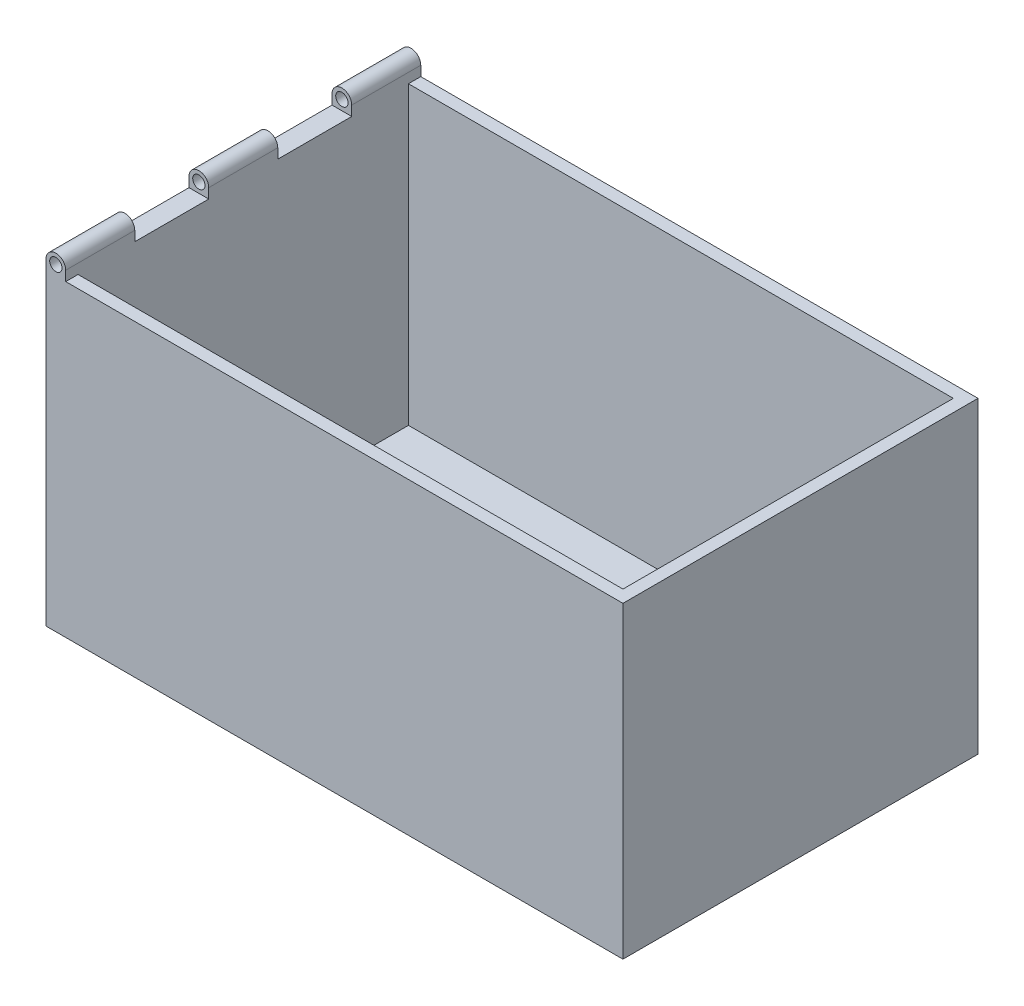
ISO-10303-21;
HEADER;
FILE_DESCRIPTION(('STEP AP214'),'2;1');
FILE_NAME('part.step','',(''),(''),'','','');
FILE_SCHEMA(('AUTOMOTIVE_DESIGN { 1 0 10303 214 1 1 1 1 }'));
ENDSEC;
DATA;
#1=APPLICATION_CONTEXT('core data for automotive mechanical design processes');
#2=APPLICATION_PROTOCOL_DEFINITION('international standard','automotive_design',2000,#1);
#3=PRODUCT_CONTEXT('',#1,'mechanical');
#4=PRODUCT('Part','Part','',(#3));
#5=PRODUCT_RELATED_PRODUCT_CATEGORY('part','',(#4));
#6=PRODUCT_DEFINITION_FORMATION('','',#4);
#7=PRODUCT_DEFINITION_CONTEXT('part definition',#1,'design');
#8=PRODUCT_DEFINITION('design','',#6,#7);
#9=PRODUCT_DEFINITION_SHAPE('','',#8);
#10=(LENGTH_UNIT() NAMED_UNIT(*) SI_UNIT(.MILLI.,.METRE.));
#11=(NAMED_UNIT(*) PLANE_ANGLE_UNIT() SI_UNIT($,.RADIAN.));
#12=(NAMED_UNIT(*) SI_UNIT($,.STERADIAN.) SOLID_ANGLE_UNIT());
#13=UNCERTAINTY_MEASURE_WITH_UNIT(LENGTH_MEASURE(1.E-05),#10,'distance_accuracy_value','');
#14=(GEOMETRIC_REPRESENTATION_CONTEXT(3) GLOBAL_UNCERTAINTY_ASSIGNED_CONTEXT((#13)) GLOBAL_UNIT_ASSIGNED_CONTEXT((#10,
#11,#12)) REPRESENTATION_CONTEXT('',''));
#15=CARTESIAN_POINT('',(0.,0.,0.));
#16=DIRECTION('',(0.,0.,1.));
#17=DIRECTION('',(1.,0.,0.));
#18=AXIS2_PLACEMENT_3D('',#15,#16,#17);
#19=CARTESIAN_POINT('',(-56.5,62.,-36.));
#20=DIRECTION('',(0.,0.,1.));
#21=DIRECTION('',(1.,0.,0.));
#22=AXIS2_PLACEMENT_3D('',#19,#20,#21);
#23=CYLINDRICAL_SURFACE('',#22,2.);
#24=CARTESIAN_POINT('',(-56.5,62.,22.));
#25=DIRECTION('',(0.,0.,1.));
#26=DIRECTION('',(1.,0.,0.));
#27=AXIS2_PLACEMENT_3D('',#24,#25,#26);
#28=CIRCLE('',#27,2.);
#29=CARTESIAN_POINT('',(-58.5,62.,22.));
#30=VERTEX_POINT('',#29);
#31=CARTESIAN_POINT('',(-54.5,62.,22.));
#32=VERTEX_POINT('',#31);
#33=EDGE_CURVE('E221',#30,#32,#28,.F.);
#34=ORIENTED_EDGE('',*,*,#33,.F.);
#35=DIRECTION('',(0.,0.,1.));
#36=VECTOR('',#35,1.);
#37=CARTESIAN_POINT('',(-58.5,62.,-36.));
#38=LINE('',#37,#36);
#39=CARTESIAN_POINT('',(-58.5,62.,36.));
#40=VERTEX_POINT('',#39);
#41=EDGE_CURVE('E187',#30,#40,#38,.T.);
#42=ORIENTED_EDGE('',*,*,#41,.T.);
#43=CARTESIAN_POINT('',(-56.5,62.,36.));
#44=DIRECTION('',(0.,0.,1.));
#45=DIRECTION('',(-1.,0.,0.));
#46=AXIS2_PLACEMENT_3D('',#43,#44,#45);
#47=CIRCLE('',#46,2.);
#48=CARTESIAN_POINT('',(-54.5,62.,36.));
#49=VERTEX_POINT('',#48);
#50=EDGE_CURVE('E238',#49,#40,#47,.T.);
#51=ORIENTED_EDGE('',*,*,#50,.F.);
#52=DIRECTION('',(0.,0.,1.));
#53=VECTOR('',#52,1.);
#54=CARTESIAN_POINT('',(-54.5,62.,-36.));
#55=LINE('',#54,#53);
#56=EDGE_CURVE('E252',#32,#49,#55,.T.);
#57=ORIENTED_EDGE('',*,*,#56,.F.);
#58=EDGE_LOOP('',(#34,#42,#51,#57));
#59=FACE_BOUND('',#58,.T.);
#60=ADVANCED_FACE('F37',(#59),#23,.T.);
#61=CARTESIAN_POINT('',(-58.5,62.,-7.));
#62=VERTEX_POINT('',#61);
#63=CARTESIAN_POINT('',(-58.5,62.,7.));
#64=VERTEX_POINT('',#63);
#65=EDGE_CURVE('E248',#62,#64,#38,.T.);
#66=ORIENTED_EDGE('',*,*,#65,.T.);
#67=CARTESIAN_POINT('',(-56.5,62.,7.));
#68=DIRECTION('',(0.,0.,-1.));
#69=DIRECTION('',(0.,1.,0.));
#70=AXIS2_PLACEMENT_3D('',#67,#68,#69);
#71=CIRCLE('',#70,2.);
#72=CARTESIAN_POINT('',(-54.5,62.,7.));
#73=VERTEX_POINT('',#72);
#74=EDGE_CURVE('E218',#73,#64,#71,.F.);
#75=ORIENTED_EDGE('',*,*,#74,.F.);
#76=CARTESIAN_POINT('',(-54.5,62.,-7.));
#77=VERTEX_POINT('',#76);
#78=EDGE_CURVE('E251',#77,#73,#55,.T.);
#79=ORIENTED_EDGE('',*,*,#78,.F.);
#80=CARTESIAN_POINT('',(-56.5,62.,-7.));
#81=DIRECTION('',(0.,0.,1.));
#82=DIRECTION('',(1.,0.,0.));
#83=AXIS2_PLACEMENT_3D('',#80,#81,#82);
#84=CIRCLE('',#83,2.);
#85=EDGE_CURVE('E213',#62,#77,#84,.F.);
#86=ORIENTED_EDGE('',*,*,#85,.F.);
#87=EDGE_LOOP('',(#66,#75,#79,#86));
#88=FACE_BOUND('',#87,.T.);
#89=ADVANCED_FACE('F326',(#88),#23,.T.);
#90=CARTESIAN_POINT('',(-56.5,62.,-36.));
#91=DIRECTION('',(0.,0.,1.));
#92=DIRECTION('',(1.,0.,0.));
#93=AXIS2_PLACEMENT_3D('',#90,#91,#92);
#94=CYLINDRICAL_SURFACE('',#93,1.25);
#95=CARTESIAN_POINT('',(-56.5,62.,22.));
#96=DIRECTION('',(0.,0.,1.));
#97=DIRECTION('',(1.,0.,0.));
#98=AXIS2_PLACEMENT_3D('',#95,#96,#97);
#99=CIRCLE('',#98,1.25);
#100=CARTESIAN_POINT('',(-55.25,62.,22.));
#101=VERTEX_POINT('',#100);
#102=EDGE_CURVE('E41',#101,#101,#99,.F.);
#103=ORIENTED_EDGE('',*,*,#102,.T.);
#104=EDGE_LOOP('',(#103));
#105=FACE_BOUND('',#104,.T.);
#106=CARTESIAN_POINT('',(-56.5,62.,36.));
#107=DIRECTION('',(0.,0.,1.));
#108=DIRECTION('',(1.,0.,0.));
#109=AXIS2_PLACEMENT_3D('',#106,#107,#108);
#110=CIRCLE('',#109,1.25);
#111=CARTESIAN_POINT('',(-55.25,62.,36.));
#112=VERTEX_POINT('',#111);
#113=EDGE_CURVE('E228',#112,#112,#110,.T.);
#114=ORIENTED_EDGE('',*,*,#113,.T.);
#115=EDGE_LOOP('',(#114));
#116=FACE_BOUND('',#115,.T.);
#117=ADVANCED_FACE('F333',(#105,#116),#94,.F.);
#118=CARTESIAN_POINT('',(0.,60.,0.));
#119=DIRECTION('',(0.,1.,0.));
#120=DIRECTION('',(0.,0.,1.));
#121=AXIS2_PLACEMENT_3D('',#118,#119,#120);
#122=PLANE('',#121);
#123=DIRECTION('',(-1.,0.,0.));
#124=VECTOR('',#123,1.);
#125=CARTESIAN_POINT('',(-54.5,60.,-33.5));
#126=LINE('',#125,#124);
#127=CARTESIAN_POINT('',(56.,60.,-33.5));
#128=VERTEX_POINT('',#127);
#129=CARTESIAN_POINT('',(-54.5,60.,-33.5));
#130=VERTEX_POINT('',#129);
#131=EDGE_CURVE('E259',#128,#130,#126,.T.);
#132=ORIENTED_EDGE('',*,*,#131,.F.);
#133=DIRECTION('',(0.,0.,-1.));
#134=VECTOR('',#133,1.);
#135=CARTESIAN_POINT('',(56.,60.,-33.5));
#136=LINE('',#135,#134);
#137=CARTESIAN_POINT('',(56.,60.,33.5));
#138=VERTEX_POINT('',#137);
#139=EDGE_CURVE('E256',#138,#128,#136,.T.);
#140=ORIENTED_EDGE('',*,*,#139,.F.);
#141=DIRECTION('',(1.,0.,0.));
#142=VECTOR('',#141,1.);
#143=CARTESIAN_POINT('',(-54.5,60.,33.5));
#144=LINE('',#143,#142);
#145=CARTESIAN_POINT('',(-54.5,60.,33.5));
#146=VERTEX_POINT('',#145);
#147=EDGE_CURVE('E254',#146,#138,#144,.T.);
#148=ORIENTED_EDGE('',*,*,#147,.F.);
#149=DIRECTION('',(0.,0.,1.));
#150=VECTOR('',#149,1.);
#151=CARTESIAN_POINT('',(-54.5,60.,-36.));
#152=LINE('',#151,#150);
#153=CARTESIAN_POINT('',(-54.5,60.,36.));
#154=VERTEX_POINT('',#153);
#155=EDGE_CURVE('E11',#146,#154,#152,.T.);
#156=ORIENTED_EDGE('',*,*,#155,.T.);
#157=DIRECTION('',(1.,0.,0.));
#158=VECTOR('',#157,1.);
#159=CARTESIAN_POINT('',(-58.5,60.,36.));
#160=LINE('',#159,#158);
#161=CARTESIAN_POINT('',(58.5,60.,36.));
#162=VERTEX_POINT('',#161);
#163=EDGE_CURVE('E280',#154,#162,#160,.T.);
#164=ORIENTED_EDGE('',*,*,#163,.T.);
#165=DIRECTION('',(0.,0.,-1.));
#166=VECTOR('',#165,1.);
#167=CARTESIAN_POINT('',(58.5,60.,-36.));
#168=LINE('',#167,#166);
#169=CARTESIAN_POINT('',(58.5,60.,-36.));
#170=VERTEX_POINT('',#169);
#171=EDGE_CURVE('E282',#162,#170,#168,.T.);
#172=ORIENTED_EDGE('',*,*,#171,.T.);
#173=DIRECTION('',(-1.,0.,0.));
#174=VECTOR('',#173,1.);
#175=CARTESIAN_POINT('',(-58.5,60.,-36.));
#176=LINE('',#175,#174);
#177=CARTESIAN_POINT('',(-54.5,60.,-36.));
#178=VERTEX_POINT('',#177);
#179=EDGE_CURVE('E284',#170,#178,#176,.T.);
#180=ORIENTED_EDGE('',*,*,#179,.T.);
#181=EDGE_CURVE('E48',#178,#130,#152,.T.);
#182=ORIENTED_EDGE('',*,*,#181,.T.);
#183=EDGE_LOOP('',(#132,#140,#148,#156,#164,#172,#180,#182));
#184=FACE_BOUND('',#183,.T.);
#185=ADVANCED_FACE('F366',(#184),#122,.T.);
#186=CARTESIAN_POINT('',(-58.5,-2.5,-36.));
#187=DIRECTION('',(-1.,0.,0.));
#188=DIRECTION('',(0.,0.,1.));
#189=AXIS2_PLACEMENT_3D('',#186,#187,#188);
#190=PLANE('',#189);
#191=DIRECTION('',(0.,-1.,0.));
#192=VECTOR('',#191,1.);
#193=CARTESIAN_POINT('',(-58.5,64.,22.));
#194=LINE('',#193,#192);
#195=CARTESIAN_POINT('',(-58.5,60.,22.));
#196=VERTEX_POINT('',#195);
#197=EDGE_CURVE('E170',#30,#196,#194,.T.);
#198=ORIENTED_EDGE('',*,*,#197,.T.);
#199=DIRECTION('',(0.,0.,-1.));
#200=VECTOR('',#199,1.);
#201=CARTESIAN_POINT('',(-58.5,60.,22.));
#202=LINE('',#201,#200);
#203=CARTESIAN_POINT('',(-58.5,60.,7.));
#204=VERTEX_POINT('',#203);
#205=EDGE_CURVE('E180',#196,#204,#202,.T.);
#206=ORIENTED_EDGE('',*,*,#205,.T.);
#207=DIRECTION('',(0.,1.,0.));
#208=VECTOR('',#207,1.);
#209=CARTESIAN_POINT('',(-58.5,64.,7.));
#210=LINE('',#209,#208);
#211=EDGE_CURVE('E177',#204,#64,#210,.T.);
#212=ORIENTED_EDGE('',*,*,#211,.T.);
#213=ORIENTED_EDGE('',*,*,#65,.F.);
#214=DIRECTION('',(0.,-1.,0.));
#215=VECTOR('',#214,1.);
#216=CARTESIAN_POINT('',(-58.5,64.,-7.));
#217=LINE('',#216,#215);
#218=CARTESIAN_POINT('',(-58.5,60.,-7.));
#219=VERTEX_POINT('',#218);
#220=EDGE_CURVE('E197',#62,#219,#217,.T.);
#221=ORIENTED_EDGE('',*,*,#220,.T.);
#222=DIRECTION('',(0.,0.,-1.));
#223=VECTOR('',#222,1.);
#224=CARTESIAN_POINT('',(-58.5,60.,-7.));
#225=LINE('',#224,#223);
#226=CARTESIAN_POINT('',(-58.5,60.,-22.));
#227=VERTEX_POINT('',#226);
#228=EDGE_CURVE('E200',#219,#227,#225,.T.);
#229=ORIENTED_EDGE('',*,*,#228,.T.);
#230=DIRECTION('',(0.,1.,0.));
#231=VECTOR('',#230,1.);
#232=CARTESIAN_POINT('',(-58.5,64.,-22.));
#233=LINE('',#232,#231);
#234=CARTESIAN_POINT('',(-58.5,62.,-22.));
#235=VERTEX_POINT('',#234);
#236=EDGE_CURVE('E203',#227,#235,#233,.T.);
#237=ORIENTED_EDGE('',*,*,#236,.T.);
#238=CARTESIAN_POINT('',(-58.5,62.,-36.));
#239=VERTEX_POINT('',#238);
#240=EDGE_CURVE('E244',#239,#235,#38,.T.);
#241=ORIENTED_EDGE('',*,*,#240,.F.);
#242=DIRECTION('',(0.,1.,0.));
#243=VECTOR('',#242,1.);
#244=CARTESIAN_POINT('',(-58.5,-2.5,-36.));
#245=LINE('',#244,#243);
#246=CARTESIAN_POINT('',(-58.5,-2.5,-36.));
#247=VERTEX_POINT('',#246);
#248=EDGE_CURVE('E46',#247,#239,#245,.T.);
#249=ORIENTED_EDGE('',*,*,#248,.F.);
#250=DIRECTION('',(0.,0.,1.));
#251=VECTOR('',#250,1.);
#252=CARTESIAN_POINT('',(-58.5,-2.5,-36.));
#253=LINE('',#252,#251);
#254=CARTESIAN_POINT('',(-58.5,-2.5,36.));
#255=VERTEX_POINT('',#254);
#256=EDGE_CURVE('E287',#247,#255,#253,.T.);
#257=ORIENTED_EDGE('',*,*,#256,.T.);
#258=DIRECTION('',(0.,1.,0.));
#259=VECTOR('',#258,1.);
#260=CARTESIAN_POINT('',(-58.5,-2.5,36.));
#261=LINE('',#260,#259);
#262=EDGE_CURVE('E299',#255,#40,#261,.T.);
#263=ORIENTED_EDGE('',*,*,#262,.T.);
#264=ORIENTED_EDGE('',*,*,#41,.F.);
#265=EDGE_LOOP('',(#198,#206,#212,#213,#221,#229,#237,#241,#249,#257,#263,#264));
#266=FACE_BOUND('',#265,.T.);
#267=ADVANCED_FACE('F39',(#266),#190,.T.);
#268=CARTESIAN_POINT('',(-58.5,-2.5,-36.));
#269=DIRECTION('',(0.,0.,-1.));
#270=DIRECTION('',(-1.,0.,0.));
#271=AXIS2_PLACEMENT_3D('',#268,#269,#270);
#272=PLANE('',#271);
#273=ORIENTED_EDGE('',*,*,#248,.T.);
#274=CARTESIAN_POINT('',(-56.5,62.,-36.));
#275=DIRECTION('',(0.,0.,1.));
#276=DIRECTION('',(-1.,0.,0.));
#277=AXIS2_PLACEMENT_3D('',#274,#275,#276);
#278=CIRCLE('',#277,2.);
#279=CARTESIAN_POINT('',(-54.5,62.,-36.));
#280=VERTEX_POINT('',#279);
#281=EDGE_CURVE('E237',#280,#239,#278,.T.);
#282=ORIENTED_EDGE('',*,*,#281,.F.);
#283=DIRECTION('',(0.,1.,0.));
#284=VECTOR('',#283,1.);
#285=CARTESIAN_POINT('',(-54.5,60.,-36.));
#286=LINE('',#285,#284);
#287=EDGE_CURVE('E234',#178,#280,#286,.T.);
#288=ORIENTED_EDGE('',*,*,#287,.F.);
#289=ORIENTED_EDGE('',*,*,#179,.F.);
#290=DIRECTION('',(0.,1.,0.));
#291=VECTOR('',#290,1.);
#292=CARTESIAN_POINT('',(58.5,-2.5,-36.));
#293=LINE('',#292,#291);
#294=CARTESIAN_POINT('',(58.5,-2.5,-36.));
#295=VERTEX_POINT('',#294);
#296=EDGE_CURVE('E301',#295,#170,#293,.T.);
#297=ORIENTED_EDGE('',*,*,#296,.F.);
#298=DIRECTION('',(-1.,0.,0.));
#299=VECTOR('',#298,1.);
#300=CARTESIAN_POINT('',(-58.5,-2.5,-36.));
#301=LINE('',#300,#299);
#302=EDGE_CURVE('E296',#295,#247,#301,.T.);
#303=ORIENTED_EDGE('',*,*,#302,.T.);
#304=EDGE_LOOP('',(#273,#282,#288,#289,#297,#303));
#305=FACE_BOUND('',#304,.T.);
#306=CARTESIAN_POINT('',(-56.5,62.,-36.));
#307=DIRECTION('',(0.,0.,1.));
#308=DIRECTION('',(1.,0.,0.));
#309=AXIS2_PLACEMENT_3D('',#306,#307,#308);
#310=CIRCLE('',#309,1.25);
#311=CARTESIAN_POINT('',(-55.25,62.,-36.));
#312=VERTEX_POINT('',#311);
#313=EDGE_CURVE('E229',#312,#312,#310,.T.);
#314=ORIENTED_EDGE('',*,*,#313,.T.);
#315=EDGE_LOOP('',(#314));
#316=FACE_BOUND('',#315,.T.);
#317=ADVANCED_FACE('F362',(#305,#316),#272,.T.);
#318=CARTESIAN_POINT('',(58.5,-2.5,-36.));
#319=DIRECTION('',(1.,0.,0.));
#320=DIRECTION('',(0.,0.,-1.));
#321=AXIS2_PLACEMENT_3D('',#318,#319,#320);
#322=PLANE('',#321);
#323=ORIENTED_EDGE('',*,*,#296,.T.);
#324=ORIENTED_EDGE('',*,*,#171,.F.);
#325=DIRECTION('',(0.,1.,0.));
#326=VECTOR('',#325,1.);
#327=CARTESIAN_POINT('',(58.5,-2.5,36.));
#328=LINE('',#327,#326);
#329=CARTESIAN_POINT('',(58.5,-2.5,36.));
#330=VERTEX_POINT('',#329);
#331=EDGE_CURVE('E304',#330,#162,#328,.T.);
#332=ORIENTED_EDGE('',*,*,#331,.F.);
#333=DIRECTION('',(0.,0.,-1.));
#334=VECTOR('',#333,1.);
#335=CARTESIAN_POINT('',(58.5,-2.5,-36.));
#336=LINE('',#335,#334);
#337=EDGE_CURVE('E293',#330,#295,#336,.T.);
#338=ORIENTED_EDGE('',*,*,#337,.T.);
#339=EDGE_LOOP('',(#323,#324,#332,#338));
#340=FACE_BOUND('',#339,.T.);
#341=ADVANCED_FACE('F370',(#340),#322,.T.);
#342=CARTESIAN_POINT('',(-58.5,-2.5,36.));
#343=DIRECTION('',(0.,0.,1.));
#344=DIRECTION('',(1.,0.,0.));
#345=AXIS2_PLACEMENT_3D('',#342,#343,#344);
#346=PLANE('',#345);
#347=ORIENTED_EDGE('',*,*,#331,.T.);
#348=ORIENTED_EDGE('',*,*,#163,.F.);
#349=DIRECTION('',(0.,1.,0.));
#350=VECTOR('',#349,1.);
#351=CARTESIAN_POINT('',(-54.5,60.,36.));
#352=LINE('',#351,#350);
#353=EDGE_CURVE('E63',#154,#49,#352,.T.);
#354=ORIENTED_EDGE('',*,*,#353,.T.);
#355=ORIENTED_EDGE('',*,*,#50,.T.);
#356=ORIENTED_EDGE('',*,*,#262,.F.);
#357=DIRECTION('',(1.,0.,0.));
#358=VECTOR('',#357,1.);
#359=CARTESIAN_POINT('',(-58.5,-2.5,36.));
#360=LINE('',#359,#358);
#361=EDGE_CURVE('E290',#255,#330,#360,.T.);
#362=ORIENTED_EDGE('',*,*,#361,.T.);
#363=EDGE_LOOP('',(#347,#348,#354,#355,#356,#362));
#364=FACE_BOUND('',#363,.T.);
#365=ORIENTED_EDGE('',*,*,#113,.F.);
#366=EDGE_LOOP('',(#365));
#367=FACE_BOUND('',#366,.T.);
#368=ADVANCED_FACE('F390',(#364,#367),#346,.T.);
#369=CARTESIAN_POINT('',(0.,-2.5,0.));
#370=DIRECTION('',(0.,1.,0.));
#371=DIRECTION('',(0.,0.,1.));
#372=AXIS2_PLACEMENT_3D('',#369,#370,#371);
#373=PLANE('',#372);
#374=ORIENTED_EDGE('',*,*,#256,.F.);
#375=ORIENTED_EDGE('',*,*,#302,.F.);
#376=ORIENTED_EDGE('',*,*,#337,.F.);
#377=ORIENTED_EDGE('',*,*,#361,.F.);
#378=EDGE_LOOP('',(#374,#375,#376,#377));
#379=FACE_BOUND('',#378,.T.);
#380=ADVANCED_FACE('F375',(#379),#373,.F.);
#381=CARTESIAN_POINT('',(-54.5,60.,-33.5));
#382=DIRECTION('',(1.,0.,0.));
#383=DIRECTION('',(0.,0.,-1.));
#384=AXIS2_PLACEMENT_3D('',#381,#382,#383);
#385=PLANE('',#384);
#386=DIRECTION('',(0.,-1.,0.));
#387=VECTOR('',#386,1.);
#388=CARTESIAN_POINT('',(-54.5,60.,22.));
#389=LINE('',#388,#387);
#390=CARTESIAN_POINT('',(-54.5,60.,22.));
#391=VERTEX_POINT('',#390);
#392=EDGE_CURVE('E173',#32,#391,#389,.T.);
#393=ORIENTED_EDGE('',*,*,#392,.F.);
#394=ORIENTED_EDGE('',*,*,#56,.T.);
#395=ORIENTED_EDGE('',*,*,#353,.F.);
#396=ORIENTED_EDGE('',*,*,#155,.F.);
#397=DIRECTION('',(0.,-1.,0.));
#398=VECTOR('',#397,1.);
#399=CARTESIAN_POINT('',(-54.5,60.,33.5));
#400=LINE('',#399,#398);
#401=CARTESIAN_POINT('',(-54.5,0.,33.5));
#402=VERTEX_POINT('',#401);
#403=EDGE_CURVE('E277',#146,#402,#400,.T.);
#404=ORIENTED_EDGE('',*,*,#403,.T.);
#405=DIRECTION('',(0.,0.,1.));
#406=VECTOR('',#405,1.);
#407=CARTESIAN_POINT('',(-54.5,0.,-33.5));
#408=LINE('',#407,#406);
#409=CARTESIAN_POINT('',(-54.5,0.,-33.5));
#410=VERTEX_POINT('',#409);
#411=EDGE_CURVE('E247',#410,#402,#408,.T.);
#412=ORIENTED_EDGE('',*,*,#411,.F.);
#413=DIRECTION('',(0.,-1.,0.));
#414=VECTOR('',#413,1.);
#415=CARTESIAN_POINT('',(-54.5,60.,-33.5));
#416=LINE('',#415,#414);
#417=EDGE_CURVE('E262',#130,#410,#416,.T.);
#418=ORIENTED_EDGE('',*,*,#417,.F.);
#419=ORIENTED_EDGE('',*,*,#181,.F.);
#420=ORIENTED_EDGE('',*,*,#287,.T.);
#421=CARTESIAN_POINT('',(-54.5,62.,-22.));
#422=VERTEX_POINT('',#421);
#423=EDGE_CURVE('E249',#280,#422,#55,.T.);
#424=ORIENTED_EDGE('',*,*,#423,.T.);
#425=DIRECTION('',(0.,1.,0.));
#426=VECTOR('',#425,1.);
#427=CARTESIAN_POINT('',(-54.5,60.,-22.));
#428=LINE('',#427,#426);
#429=CARTESIAN_POINT('',(-54.5,60.,-22.));
#430=VERTEX_POINT('',#429);
#431=EDGE_CURVE('E210',#430,#422,#428,.T.);
#432=ORIENTED_EDGE('',*,*,#431,.F.);
#433=DIRECTION('',(0.,0.,-1.));
#434=VECTOR('',#433,1.);
#435=CARTESIAN_POINT('',(-54.5,60.,-33.5));
#436=LINE('',#435,#434);
#437=CARTESIAN_POINT('',(-54.5,60.,-7.));
#438=VERTEX_POINT('',#437);
#439=EDGE_CURVE('E224',#438,#430,#436,.T.);
#440=ORIENTED_EDGE('',*,*,#439,.F.);
#441=DIRECTION('',(0.,-1.,0.));
#442=VECTOR('',#441,1.);
#443=CARTESIAN_POINT('',(-54.5,60.,-7.));
#444=LINE('',#443,#442);
#445=EDGE_CURVE('E215',#77,#438,#444,.T.);
#446=ORIENTED_EDGE('',*,*,#445,.F.);
#447=ORIENTED_EDGE('',*,*,#78,.T.);
#448=DIRECTION('',(0.,1.,0.));
#449=VECTOR('',#448,1.);
#450=CARTESIAN_POINT('',(-54.5,60.,7.));
#451=LINE('',#450,#449);
#452=CARTESIAN_POINT('',(-54.5,60.,7.));
#453=VERTEX_POINT('',#452);
#454=EDGE_CURVE('E55',#453,#73,#451,.T.);
#455=ORIENTED_EDGE('',*,*,#454,.F.);
#456=DIRECTION('',(0.,0.,-1.));
#457=VECTOR('',#456,1.);
#458=CARTESIAN_POINT('',(-54.5,60.,-33.5));
#459=LINE('',#458,#457);
#460=EDGE_CURVE('E226',#391,#453,#459,.T.);
#461=ORIENTED_EDGE('',*,*,#460,.F.);
#462=EDGE_LOOP('',(#393,#394,#395,#396,#404,#412,#418,#419,#420,#424,#432,#440,#446,#447,#455,#461));
#463=FACE_BOUND('',#462,.T.);
#464=ADVANCED_FACE('F356',(#463),#385,.T.);
#465=CARTESIAN_POINT('',(-54.5,60.,33.5));
#466=DIRECTION('',(0.,0.,-1.));
#467=DIRECTION('',(-1.,0.,0.));
#468=AXIS2_PLACEMENT_3D('',#465,#466,#467);
#469=PLANE('',#468);
#470=DIRECTION('',(1.,0.,0.));
#471=VECTOR('',#470,1.);
#472=CARTESIAN_POINT('',(-54.5,0.,33.5));
#473=LINE('',#472,#471);
#474=CARTESIAN_POINT('',(56.,0.,33.5));
#475=VERTEX_POINT('',#474);
#476=EDGE_CURVE('E264',#402,#475,#473,.T.);
#477=ORIENTED_EDGE('',*,*,#476,.F.);
#478=ORIENTED_EDGE('',*,*,#403,.F.);
#479=ORIENTED_EDGE('',*,*,#147,.T.);
#480=DIRECTION('',(0.,-1.,0.));
#481=VECTOR('',#480,1.);
#482=CARTESIAN_POINT('',(56.,60.,33.5));
#483=LINE('',#482,#481);
#484=EDGE_CURVE('E274',#138,#475,#483,.T.);
#485=ORIENTED_EDGE('',*,*,#484,.T.);
#486=EDGE_LOOP('',(#477,#478,#479,#485));
#487=FACE_BOUND('',#486,.T.);
#488=ADVANCED_FACE('F485',(#487),#469,.T.);
#489=CARTESIAN_POINT('',(56.,60.,-33.5));
#490=DIRECTION('',(-1.,0.,0.));
#491=DIRECTION('',(0.,0.,1.));
#492=AXIS2_PLACEMENT_3D('',#489,#490,#491);
#493=PLANE('',#492);
#494=DIRECTION('',(0.,0.,-1.));
#495=VECTOR('',#494,1.);
#496=CARTESIAN_POINT('',(56.,0.,-33.5));
#497=LINE('',#496,#495);
#498=CARTESIAN_POINT('',(56.,0.,-33.5));
#499=VERTEX_POINT('',#498);
#500=EDGE_CURVE('E266',#475,#499,#497,.T.);
#501=ORIENTED_EDGE('',*,*,#500,.F.);
#502=ORIENTED_EDGE('',*,*,#484,.F.);
#503=ORIENTED_EDGE('',*,*,#139,.T.);
#504=DIRECTION('',(0.,-1.,0.));
#505=VECTOR('',#504,1.);
#506=CARTESIAN_POINT('',(56.,60.,-33.5));
#507=LINE('',#506,#505);
#508=EDGE_CURVE('E271',#128,#499,#507,.T.);
#509=ORIENTED_EDGE('',*,*,#508,.T.);
#510=EDGE_LOOP('',(#501,#502,#503,#509));
#511=FACE_BOUND('',#510,.T.);
#512=ADVANCED_FACE('F477',(#511),#493,.T.);
#513=CARTESIAN_POINT('',(-54.5,60.,-33.5));
#514=DIRECTION('',(0.,0.,1.));
#515=DIRECTION('',(1.,0.,0.));
#516=AXIS2_PLACEMENT_3D('',#513,#514,#515);
#517=PLANE('',#516);
#518=DIRECTION('',(-1.,0.,0.));
#519=VECTOR('',#518,1.);
#520=CARTESIAN_POINT('',(-54.5,0.,-33.5));
#521=LINE('',#520,#519);
#522=EDGE_CURVE('E257',#499,#410,#521,.T.);
#523=ORIENTED_EDGE('',*,*,#522,.F.);
#524=ORIENTED_EDGE('',*,*,#508,.F.);
#525=ORIENTED_EDGE('',*,*,#131,.T.);
#526=ORIENTED_EDGE('',*,*,#417,.T.);
#527=EDGE_LOOP('',(#523,#524,#525,#526));
#528=FACE_BOUND('',#527,.T.);
#529=ADVANCED_FACE('F347',(#528),#517,.T.);
#530=CARTESIAN_POINT('',(0.,0.,0.));
#531=DIRECTION('',(0.,1.,0.));
#532=DIRECTION('',(0.,0.,1.));
#533=AXIS2_PLACEMENT_3D('',#530,#531,#532);
#534=PLANE('',#533);
#535=ORIENTED_EDGE('',*,*,#411,.T.);
#536=ORIENTED_EDGE('',*,*,#476,.T.);
#537=ORIENTED_EDGE('',*,*,#500,.T.);
#538=ORIENTED_EDGE('',*,*,#522,.T.);
#539=EDGE_LOOP('',(#535,#536,#537,#538));
#540=FACE_BOUND('',#539,.T.);
#541=ADVANCED_FACE('F339',(#540),#534,.T.);
#542=CARTESIAN_POINT('',(-56.5,62.,-22.));
#543=DIRECTION('',(0.,0.,-1.));
#544=DIRECTION('',(-1.,0.,0.));
#545=AXIS2_PLACEMENT_3D('',#542,#543,#544);
#546=CIRCLE('',#545,2.);
#547=EDGE_CURVE('E208',#422,#235,#546,.F.);
#548=ORIENTED_EDGE('',*,*,#547,.F.);
#549=ORIENTED_EDGE('',*,*,#423,.F.);
#550=ORIENTED_EDGE('',*,*,#281,.T.);
#551=ORIENTED_EDGE('',*,*,#240,.T.);
#552=EDGE_LOOP('',(#548,#549,#550,#551));
#553=FACE_BOUND('',#552,.T.);
#554=ADVANCED_FACE('F329',(#553),#23,.T.);
#555=CARTESIAN_POINT('',(-56.5,62.,-22.));
#556=DIRECTION('',(0.,0.,-1.));
#557=DIRECTION('',(-1.,0.,0.));
#558=AXIS2_PLACEMENT_3D('',#555,#556,#557);
#559=CIRCLE('',#558,1.25);
#560=CARTESIAN_POINT('',(-57.75,62.,-22.));
#561=VERTEX_POINT('',#560);
#562=EDGE_CURVE('E195',#561,#561,#559,.F.);
#563=ORIENTED_EDGE('',*,*,#562,.T.);
#564=EDGE_LOOP('',(#563));
#565=FACE_BOUND('',#564,.T.);
#566=ORIENTED_EDGE('',*,*,#313,.F.);
#567=EDGE_LOOP('',(#566));
#568=FACE_BOUND('',#567,.T.);
#569=ADVANCED_FACE('F338',(#565,#568),#94,.F.);
#570=CARTESIAN_POINT('',(-58.5,60.,-7.));
#571=DIRECTION('',(0.,-1.,0.));
#572=DIRECTION('',(0.,0.,-1.));
#573=AXIS2_PLACEMENT_3D('',#570,#571,#572);
#574=PLANE('',#573);
#575=ORIENTED_EDGE('',*,*,#439,.T.);
#576=DIRECTION('',(1.,0.,0.));
#577=VECTOR('',#576,1.);
#578=CARTESIAN_POINT('',(-58.5,60.,-22.));
#579=LINE('',#578,#577);
#580=EDGE_CURVE('E188',#227,#430,#579,.T.);
#581=ORIENTED_EDGE('',*,*,#580,.F.);
#582=ORIENTED_EDGE('',*,*,#228,.F.);
#583=DIRECTION('',(1.,0.,0.));
#584=VECTOR('',#583,1.);
#585=CARTESIAN_POINT('',(-58.5,60.,-7.));
#586=LINE('',#585,#584);
#587=EDGE_CURVE('E191',#219,#438,#586,.T.);
#588=ORIENTED_EDGE('',*,*,#587,.T.);
#589=EDGE_LOOP('',(#575,#581,#582,#588));
#590=FACE_BOUND('',#589,.T.);
#591=ADVANCED_FACE('F345',(#590),#574,.F.);
#592=CARTESIAN_POINT('',(-58.5,64.,-7.));
#593=DIRECTION('',(0.,0.,1.));
#594=DIRECTION('',(1.,0.,0.));
#595=AXIS2_PLACEMENT_3D('',#592,#593,#594);
#596=PLANE('',#595);
#597=ORIENTED_EDGE('',*,*,#445,.T.);
#598=ORIENTED_EDGE('',*,*,#587,.F.);
#599=ORIENTED_EDGE('',*,*,#220,.F.);
#600=ORIENTED_EDGE('',*,*,#85,.T.);
#601=EDGE_LOOP('',(#597,#598,#599,#600));
#602=FACE_BOUND('',#601,.T.);
#603=CARTESIAN_POINT('',(-56.5,62.,-7.));
#604=DIRECTION('',(0.,0.,1.));
#605=DIRECTION('',(1.,0.,0.));
#606=AXIS2_PLACEMENT_3D('',#603,#604,#605);
#607=CIRCLE('',#606,1.25);
#608=CARTESIAN_POINT('',(-55.25,62.,-7.));
#609=VERTEX_POINT('',#608);
#610=EDGE_CURVE('E212',#609,#609,#607,.F.);
#611=ORIENTED_EDGE('',*,*,#610,.F.);
#612=EDGE_LOOP('',(#611));
#613=FACE_BOUND('',#612,.T.);
#614=ADVANCED_FACE('F408',(#602,#613),#596,.F.);
#615=CARTESIAN_POINT('',(-58.5,64.,-22.));
#616=DIRECTION('',(0.,0.,-1.));
#617=DIRECTION('',(-1.,0.,0.));
#618=AXIS2_PLACEMENT_3D('',#615,#616,#617);
#619=PLANE('',#618);
#620=ORIENTED_EDGE('',*,*,#431,.T.);
#621=ORIENTED_EDGE('',*,*,#547,.T.);
#622=ORIENTED_EDGE('',*,*,#236,.F.);
#623=ORIENTED_EDGE('',*,*,#580,.T.);
#624=EDGE_LOOP('',(#620,#621,#622,#623));
#625=FACE_BOUND('',#624,.T.);
#626=ORIENTED_EDGE('',*,*,#562,.F.);
#627=EDGE_LOOP('',(#626));
#628=FACE_BOUND('',#627,.T.);
#629=ADVANCED_FACE('F378',(#625,#628),#619,.F.);
#630=CARTESIAN_POINT('',(-56.5,62.,7.));
#631=DIRECTION('',(0.,0.,-1.));
#632=DIRECTION('',(0.,1.,0.));
#633=AXIS2_PLACEMENT_3D('',#630,#631,#632);
#634=CIRCLE('',#633,1.25);
#635=CARTESIAN_POINT('',(-56.5,63.25,7.));
#636=VERTEX_POINT('',#635);
#637=EDGE_CURVE('E217',#636,#636,#634,.F.);
#638=ORIENTED_EDGE('',*,*,#637,.T.);
#639=EDGE_LOOP('',(#638));
#640=FACE_BOUND('',#639,.T.);
#641=ORIENTED_EDGE('',*,*,#610,.T.);
#642=EDGE_LOOP('',(#641));
#643=FACE_BOUND('',#642,.T.);
#644=ADVANCED_FACE('F314',(#640,#643),#94,.F.);
#645=CARTESIAN_POINT('',(-58.5,60.,22.));
#646=DIRECTION('',(0.,-1.,0.));
#647=DIRECTION('',(0.,0.,-1.));
#648=AXIS2_PLACEMENT_3D('',#645,#646,#647);
#649=PLANE('',#648);
#650=ORIENTED_EDGE('',*,*,#460,.T.);
#651=DIRECTION('',(1.,0.,0.));
#652=VECTOR('',#651,1.);
#653=CARTESIAN_POINT('',(-58.5,60.,7.));
#654=LINE('',#653,#652);
#655=EDGE_CURVE('E176',#204,#453,#654,.T.);
#656=ORIENTED_EDGE('',*,*,#655,.F.);
#657=ORIENTED_EDGE('',*,*,#205,.F.);
#658=DIRECTION('',(1.,0.,0.));
#659=VECTOR('',#658,1.);
#660=CARTESIAN_POINT('',(-58.5,60.,22.));
#661=LINE('',#660,#659);
#662=EDGE_CURVE('E165',#196,#391,#661,.T.);
#663=ORIENTED_EDGE('',*,*,#662,.T.);
#664=EDGE_LOOP('',(#650,#656,#657,#663));
#665=FACE_BOUND('',#664,.T.);
#666=ADVANCED_FACE('F181',(#665),#649,.F.);
#667=CARTESIAN_POINT('',(-58.5,64.,22.));
#668=DIRECTION('',(0.,0.,1.));
#669=DIRECTION('',(1.,0.,0.));
#670=AXIS2_PLACEMENT_3D('',#667,#668,#669);
#671=PLANE('',#670);
#672=ORIENTED_EDGE('',*,*,#392,.T.);
#673=ORIENTED_EDGE('',*,*,#662,.F.);
#674=ORIENTED_EDGE('',*,*,#197,.F.);
#675=ORIENTED_EDGE('',*,*,#33,.T.);
#676=EDGE_LOOP('',(#672,#673,#674,#675));
#677=FACE_BOUND('',#676,.T.);
#678=ORIENTED_EDGE('',*,*,#102,.F.);
#679=EDGE_LOOP('',(#678));
#680=FACE_BOUND('',#679,.T.);
#681=ADVANCED_FACE('F167',(#677,#680),#671,.F.);
#682=CARTESIAN_POINT('',(-58.5,64.,7.));
#683=DIRECTION('',(0.,0.,-1.));
#684=DIRECTION('',(0.,1.,0.));
#685=AXIS2_PLACEMENT_3D('',#682,#683,#684);
#686=PLANE('',#685);
#687=ORIENTED_EDGE('',*,*,#454,.T.);
#688=ORIENTED_EDGE('',*,*,#74,.T.);
#689=ORIENTED_EDGE('',*,*,#211,.F.);
#690=ORIENTED_EDGE('',*,*,#655,.T.);
#691=EDGE_LOOP('',(#687,#688,#689,#690));
#692=FACE_BOUND('',#691,.T.);
#693=ORIENTED_EDGE('',*,*,#637,.F.);
#694=EDGE_LOOP('',(#693));
#695=FACE_BOUND('',#694,.T.);
#696=ADVANCED_FACE('F317',(#692,#695),#686,.F.);
#697=CLOSED_SHELL('',(#60,#89,#117,#185,#267,#317,#341,#368,#380,#464,#488,#512,#529,#541,#554,
#569,#591,#614,#629,#644,#666,#681,#696));
#698=MANIFOLD_SOLID_BREP('B2',#697);
#699=ADVANCED_BREP_SHAPE_REPRESENTATION('',(#18,#698),#14);
#700=SHAPE_DEFINITION_REPRESENTATION(#9,#699);
ENDSEC;
END-ISO-10303-21;
